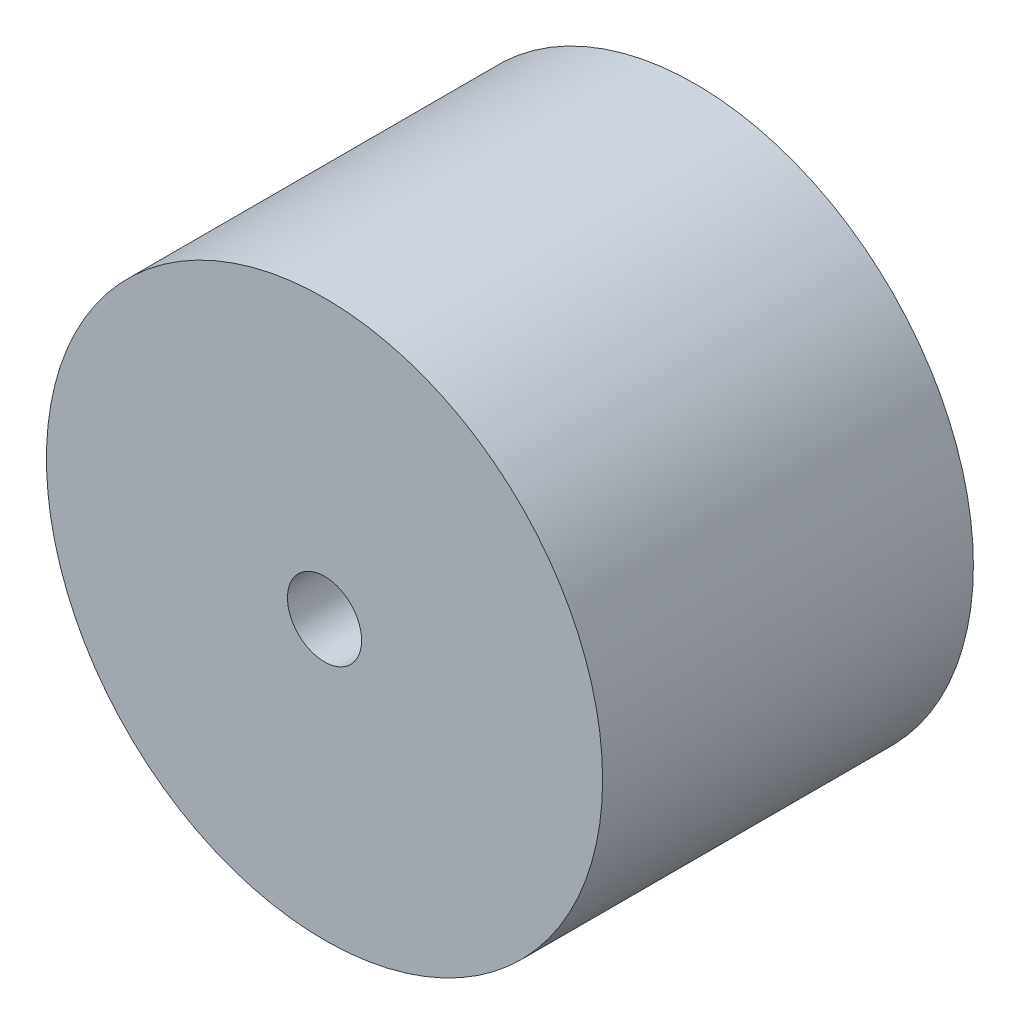
ISO-10303-21;
HEADER;
FILE_DESCRIPTION(('STEP AP214'),'2;1');
FILE_NAME('part.step','',(''),(''),'','','');
FILE_SCHEMA(('AUTOMOTIVE_DESIGN { 1 0 10303 214 1 1 1 1 }'));
ENDSEC;
DATA;
#1=APPLICATION_CONTEXT('core data for automotive mechanical design processes');
#2=APPLICATION_PROTOCOL_DEFINITION('international standard','automotive_design',2000,#1);
#3=PRODUCT_CONTEXT('',#1,'mechanical');
#4=PRODUCT('Part','Part','',(#3));
#5=PRODUCT_RELATED_PRODUCT_CATEGORY('part','',(#4));
#6=PRODUCT_DEFINITION_FORMATION('','',#4);
#7=PRODUCT_DEFINITION_CONTEXT('part definition',#1,'design');
#8=PRODUCT_DEFINITION('design','',#6,#7);
#9=PRODUCT_DEFINITION_SHAPE('','',#8);
#10=(LENGTH_UNIT() NAMED_UNIT(*) SI_UNIT(.MILLI.,.METRE.));
#11=(NAMED_UNIT(*) PLANE_ANGLE_UNIT() SI_UNIT($,.RADIAN.));
#12=(NAMED_UNIT(*) SI_UNIT($,.STERADIAN.) SOLID_ANGLE_UNIT());
#13=UNCERTAINTY_MEASURE_WITH_UNIT(LENGTH_MEASURE(1.E-05),#10,'distance_accuracy_value','');
#14=(GEOMETRIC_REPRESENTATION_CONTEXT(3) GLOBAL_UNCERTAINTY_ASSIGNED_CONTEXT((#13)) GLOBAL_UNIT_ASSIGNED_CONTEXT((#10,
#11,#12)) REPRESENTATION_CONTEXT('',''));
#15=CARTESIAN_POINT('',(0.,0.,0.));
#16=DIRECTION('',(0.,0.,1.));
#17=DIRECTION('',(1.,0.,0.));
#18=AXIS2_PLACEMENT_3D('',#15,#16,#17);
#19=CARTESIAN_POINT('',(0.,0.,20.));
#20=DIRECTION('',(0.,0.,1.));
#21=DIRECTION('',(1.,0.,0.));
#22=AXIS2_PLACEMENT_3D('',#19,#20,#21);
#23=PLANE('',#22);
#24=CARTESIAN_POINT('',(0.,0.,20.));
#25=DIRECTION('',(0.,0.,1.));
#26=DIRECTION('',(1.,0.,0.));
#27=AXIS2_PLACEMENT_3D('',#24,#25,#26);
#28=CIRCLE('',#27,15.);
#29=CARTESIAN_POINT('',(15.,0.,20.));
#30=VERTEX_POINT('',#29);
#31=EDGE_CURVE('E10',#30,#30,#28,.T.);
#32=ORIENTED_EDGE('',*,*,#31,.T.);
#33=EDGE_LOOP('',(#32));
#34=FACE_BOUND('',#33,.T.);
#35=CARTESIAN_POINT('',(0.,0.,20.));
#36=DIRECTION('',(0.,0.,1.));
#37=DIRECTION('',(1.,0.,0.));
#38=AXIS2_PLACEMENT_3D('',#35,#36,#37);
#39=CIRCLE('',#38,2.);
#40=CARTESIAN_POINT('',(2.,0.,20.));
#41=VERTEX_POINT('',#40);
#42=EDGE_CURVE('E48',#41,#41,#39,.T.);
#43=ORIENTED_EDGE('',*,*,#42,.F.);
#44=EDGE_LOOP('',(#43));
#45=FACE_BOUND('',#44,.T.);
#46=ADVANCED_FACE('F40',(#34,#45),#23,.T.);
#47=CARTESIAN_POINT('',(0.,0.,0.));
#48=DIRECTION('',(0.,0.,1.));
#49=DIRECTION('',(1.,0.,0.));
#50=AXIS2_PLACEMENT_3D('',#47,#48,#49);
#51=PLANE('',#50);
#52=CARTESIAN_POINT('',(0.,0.,0.));
#53=DIRECTION('',(0.,0.,1.));
#54=DIRECTION('',(1.,0.,0.));
#55=AXIS2_PLACEMENT_3D('',#52,#53,#54);
#56=CIRCLE('',#55,15.);
#57=CARTESIAN_POINT('',(15.,0.,0.));
#58=VERTEX_POINT('',#57);
#59=EDGE_CURVE('E41',#58,#58,#56,.T.);
#60=ORIENTED_EDGE('',*,*,#59,.F.);
#61=EDGE_LOOP('',(#60));
#62=FACE_BOUND('',#61,.T.);
#63=CARTESIAN_POINT('',(0.,0.,0.));
#64=DIRECTION('',(0.,0.,1.));
#65=DIRECTION('',(1.,0.,0.));
#66=AXIS2_PLACEMENT_3D('',#63,#64,#65);
#67=CIRCLE('',#66,2.);
#68=CARTESIAN_POINT('',(2.,0.,0.));
#69=VERTEX_POINT('',#68);
#70=EDGE_CURVE('E49',#69,#69,#67,.T.);
#71=ORIENTED_EDGE('',*,*,#70,.T.);
#72=EDGE_LOOP('',(#71));
#73=FACE_BOUND('',#72,.T.);
#74=ADVANCED_FACE('F58',(#62,#73),#51,.F.);
#75=CARTESIAN_POINT('',(0.,0.,20.));
#76=DIRECTION('',(0.,0.,-1.));
#77=DIRECTION('',(-1.,0.,0.));
#78=AXIS2_PLACEMENT_3D('',#75,#76,#77);
#79=CYLINDRICAL_SURFACE('',#78,15.);
#80=ORIENTED_EDGE('',*,*,#31,.F.);
#81=EDGE_LOOP('',(#80));
#82=FACE_BOUND('',#81,.T.);
#83=ORIENTED_EDGE('',*,*,#59,.T.);
#84=EDGE_LOOP('',(#83));
#85=FACE_BOUND('',#84,.T.);
#86=ADVANCED_FACE('F39',(#82,#85),#79,.T.);
#87=CARTESIAN_POINT('',(0.,0.,20.));
#88=DIRECTION('',(0.,0.,-1.));
#89=DIRECTION('',(-1.,0.,0.));
#90=AXIS2_PLACEMENT_3D('',#87,#88,#89);
#91=CYLINDRICAL_SURFACE('',#90,2.);
#92=ORIENTED_EDGE('',*,*,#42,.T.);
#93=EDGE_LOOP('',(#92));
#94=FACE_BOUND('',#93,.T.);
#95=ORIENTED_EDGE('',*,*,#70,.F.);
#96=EDGE_LOOP('',(#95));
#97=FACE_BOUND('',#96,.T.);
#98=ADVANCED_FACE('F57',(#94,#97),#91,.F.);
#99=CLOSED_SHELL('',(#46,#74,#86,#98));
#100=MANIFOLD_SOLID_BREP('B2',#99);
#101=ADVANCED_BREP_SHAPE_REPRESENTATION('',(#18,#100),#14);
#102=SHAPE_DEFINITION_REPRESENTATION(#9,#101);
ENDSEC;
END-ISO-10303-21;
